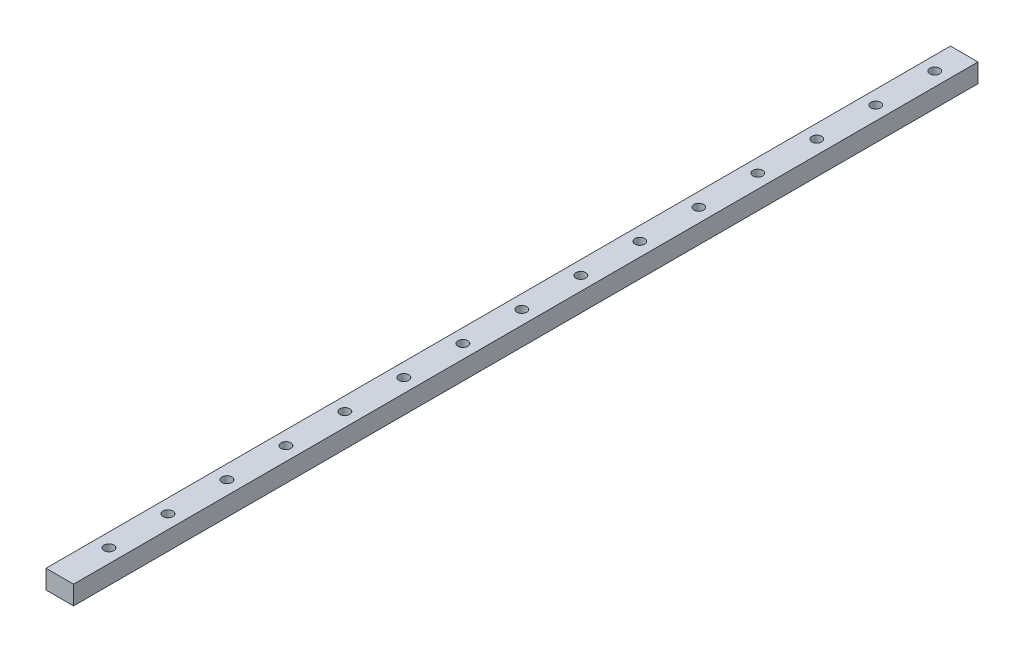
ISO-10303-21;
HEADER;
FILE_DESCRIPTION(('STEP AP214'),'2;1');
FILE_NAME('part.step','',(''),(''),'','','');
FILE_SCHEMA(('AUTOMOTIVE_DESIGN { 1 0 10303 214 1 1 1 1 }'));
ENDSEC;
DATA;
#1=APPLICATION_CONTEXT('core data for automotive mechanical design processes');
#2=APPLICATION_PROTOCOL_DEFINITION('international standard','automotive_design',2000,#1);
#3=PRODUCT_CONTEXT('',#1,'mechanical');
#4=PRODUCT('Part','Part','',(#3));
#5=PRODUCT_RELATED_PRODUCT_CATEGORY('part','',(#4));
#6=PRODUCT_DEFINITION_FORMATION('','',#4);
#7=PRODUCT_DEFINITION_CONTEXT('part definition',#1,'design');
#8=PRODUCT_DEFINITION('design','',#6,#7);
#9=PRODUCT_DEFINITION_SHAPE('','',#8);
#10=(LENGTH_UNIT() NAMED_UNIT(*) SI_UNIT(.MILLI.,.METRE.));
#11=(NAMED_UNIT(*) PLANE_ANGLE_UNIT() SI_UNIT($,.RADIAN.));
#12=(NAMED_UNIT(*) SI_UNIT($,.STERADIAN.) SOLID_ANGLE_UNIT());
#13=UNCERTAINTY_MEASURE_WITH_UNIT(LENGTH_MEASURE(1.E-05),#10,'distance_accuracy_value','');
#14=(GEOMETRIC_REPRESENTATION_CONTEXT(3) GLOBAL_UNCERTAINTY_ASSIGNED_CONTEXT((#13)) GLOBAL_UNIT_ASSIGNED_CONTEXT((#10,
#11,#12)) REPRESENTATION_CONTEXT('',''));
#15=CARTESIAN_POINT('',(0.,0.,0.));
#16=DIRECTION('',(0.,0.,1.));
#17=DIRECTION('',(1.,0.,0.));
#18=AXIS2_PLACEMENT_3D('',#15,#16,#17);
#19=CARTESIAN_POINT('',(0.,4.8,0.));
#20=DIRECTION('',(0.,1.,0.));
#21=DIRECTION('',(0.,0.,1.));
#22=AXIS2_PLACEMENT_3D('',#19,#20,#21);
#23=PLANE('',#22);
#24=CARTESIAN_POINT('',(2.03057627693155E-12,4.8,87.4999999999999));
#25=DIRECTION('',(0.,1.,0.));
#26=DIRECTION('',(0.,0.,1.));
#27=AXIS2_PLACEMENT_3D('',#24,#25,#26);
#28=CIRCLE('',#27,1.25);
#29=CARTESIAN_POINT('',(2.03057627693155E-12,4.8,88.7499999999999));
#30=VERTEX_POINT('',#29);
#31=EDGE_CURVE('E193',#30,#30,#28,.T.);
#32=ORIENTED_EDGE('',*,*,#31,.F.);
#33=EDGE_LOOP('',(#32));
#34=FACE_BOUND('',#33,.T.);
#35=CARTESIAN_POINT('',(1.71817992663439E-12,4.8,57.4999999999999));
#36=DIRECTION('',(0.,1.,0.));
#37=DIRECTION('',(0.,0.,1.));
#38=AXIS2_PLACEMENT_3D('',#35,#36,#37);
#39=CIRCLE('',#38,1.25);
#40=CARTESIAN_POINT('',(1.71817992663439E-12,4.8,58.7499999999999));
#41=VERTEX_POINT('',#40);
#42=EDGE_CURVE('E181',#41,#41,#39,.T.);
#43=ORIENTED_EDGE('',*,*,#42,.F.);
#44=EDGE_LOOP('',(#43));
#45=FACE_BOUND('',#44,.T.);
#46=CARTESIAN_POINT('',(1.40578357633722E-12,4.8,27.4999999999999));
#47=DIRECTION('',(0.,1.,0.));
#48=DIRECTION('',(0.,0.,1.));
#49=AXIS2_PLACEMENT_3D('',#46,#47,#48);
#50=CIRCLE('',#49,1.25);
#51=CARTESIAN_POINT('',(1.40578357633722E-12,4.8,28.7499999999999));
#52=VERTEX_POINT('',#51);
#53=EDGE_CURVE('E169',#52,#52,#50,.T.);
#54=ORIENTED_EDGE('',*,*,#53,.F.);
#55=EDGE_LOOP('',(#54));
#56=FACE_BOUND('',#55,.T.);
#57=CARTESIAN_POINT('',(1.09338722604006E-12,4.8,-2.5000000000001));
#58=DIRECTION('',(0.,1.,0.));
#59=DIRECTION('',(0.,0.,1.));
#60=AXIS2_PLACEMENT_3D('',#57,#58,#59);
#61=CIRCLE('',#60,1.25);
#62=CARTESIAN_POINT('',(1.09338722604006E-12,4.8,-1.2500000000001));
#63=VERTEX_POINT('',#62);
#64=EDGE_CURVE('E157',#63,#63,#61,.T.);
#65=ORIENTED_EDGE('',*,*,#64,.F.);
#66=EDGE_LOOP('',(#65));
#67=FACE_BOUND('',#66,.T.);
#68=CARTESIAN_POINT('',(7.80990875742902E-13,4.8,-32.5000000000001));
#69=DIRECTION('',(0.,1.,0.));
#70=DIRECTION('',(0.,0.,1.));
#71=AXIS2_PLACEMENT_3D('',#68,#69,#70);
#72=CIRCLE('',#71,1.25);
#73=CARTESIAN_POINT('',(7.80990875742902E-13,4.8,-31.2500000000001));
#74=VERTEX_POINT('',#73);
#75=EDGE_CURVE('E145',#74,#74,#72,.T.);
#76=ORIENTED_EDGE('',*,*,#75,.F.);
#77=EDGE_LOOP('',(#76));
#78=FACE_BOUND('',#77,.T.);
#79=CARTESIAN_POINT('',(4.68594525445742E-13,4.8,-62.5000000000001));
#80=DIRECTION('',(0.,1.,0.));
#81=DIRECTION('',(0.,0.,1.));
#82=AXIS2_PLACEMENT_3D('',#79,#80,#81);
#83=CIRCLE('',#82,1.25);
#84=CARTESIAN_POINT('',(4.68594525445742E-13,4.8,-61.2500000000001));
#85=VERTEX_POINT('',#84);
#86=EDGE_CURVE('E133',#85,#85,#83,.T.);
#87=ORIENTED_EDGE('',*,*,#86,.F.);
#88=EDGE_LOOP('',(#87));
#89=FACE_BOUND('',#88,.T.);
#90=CARTESIAN_POINT('',(1.5619817514858E-13,4.8,-92.5000000000001));
#91=DIRECTION('',(0.,1.,0.));
#92=DIRECTION('',(0.,0.,1.));
#93=AXIS2_PLACEMENT_3D('',#90,#91,#92);
#94=CIRCLE('',#93,1.25);
#95=CARTESIAN_POINT('',(1.5619817514858E-13,4.8,-91.2500000000001));
#96=VERTEX_POINT('',#95);
#97=EDGE_CURVE('E121',#96,#96,#94,.T.);
#98=ORIENTED_EDGE('',*,*,#97,.F.);
#99=EDGE_LOOP('',(#98));
#100=FACE_BOUND('',#99,.T.);
#101=DIRECTION('',(0.,0.,-1.));
#102=VECTOR('',#101,1.);
#103=CARTESIAN_POINT('',(3.49999999999999,4.8,-115.));
#104=LINE('',#103,#102);
#105=CARTESIAN_POINT('',(3.50000000000002,4.8,115.));
#106=VERTEX_POINT('',#105);
#107=CARTESIAN_POINT('',(3.49999999999999,4.8,-115.));
#108=VERTEX_POINT('',#107);
#109=EDGE_CURVE('E91',#106,#108,#104,.T.);
#110=ORIENTED_EDGE('',*,*,#109,.T.);
#111=DIRECTION('',(-1.,0.,0.));
#112=VECTOR('',#111,1.);
#113=CARTESIAN_POINT('',(-3.50000000000001,4.8,-115.));
#114=LINE('',#113,#112);
#115=CARTESIAN_POINT('',(-3.50000000000001,4.8,-115.));
#116=VERTEX_POINT('',#115);
#117=EDGE_CURVE('E86',#108,#116,#114,.T.);
#118=ORIENTED_EDGE('',*,*,#117,.T.);
#119=DIRECTION('',(0.,0.,1.));
#120=VECTOR('',#119,1.);
#121=CARTESIAN_POINT('',(-3.50000000000001,4.8,-115.));
#122=LINE('',#121,#120);
#123=CARTESIAN_POINT('',(-3.49999999999998,4.8,115.));
#124=VERTEX_POINT('',#123);
#125=EDGE_CURVE('E89',#116,#124,#122,.T.);
#126=ORIENTED_EDGE('',*,*,#125,.T.);
#127=DIRECTION('',(1.,0.,0.));
#128=VECTOR('',#127,1.);
#129=CARTESIAN_POINT('',(-3.49999999999998,4.8,115.));
#130=LINE('',#129,#128);
#131=EDGE_CURVE('E56',#124,#106,#130,.T.);
#132=ORIENTED_EDGE('',*,*,#131,.T.);
#133=EDGE_LOOP('',(#110,#118,#126,#132));
#134=FACE_BOUND('',#133,.T.);
#135=CARTESIAN_POINT('',(0.,4.8,-107.5));
#136=DIRECTION('',(0.,1.,0.));
#137=DIRECTION('',(0.,0.,1.));
#138=AXIS2_PLACEMENT_3D('',#135,#136,#137);
#139=CIRCLE('',#138,1.25);
#140=CARTESIAN_POINT('',(0.,4.8,-106.25));
#141=VERTEX_POINT('',#140);
#142=EDGE_CURVE('E106',#141,#141,#139,.T.);
#143=ORIENTED_EDGE('',*,*,#142,.F.);
#144=EDGE_LOOP('',(#143));
#145=FACE_BOUND('',#144,.T.);
#146=CARTESIAN_POINT('',(3.12396350297161E-13,4.8,-77.5000000000001));
#147=DIRECTION('',(0.,1.,0.));
#148=DIRECTION('',(0.,0.,1.));
#149=AXIS2_PLACEMENT_3D('',#146,#147,#148);
#150=CIRCLE('',#149,1.25);
#151=CARTESIAN_POINT('',(3.12396350297161E-13,4.8,-76.2500000000001));
#152=VERTEX_POINT('',#151);
#153=EDGE_CURVE('E127',#152,#152,#150,.T.);
#154=ORIENTED_EDGE('',*,*,#153,.F.);
#155=EDGE_LOOP('',(#154));
#156=FACE_BOUND('',#155,.T.);
#157=CARTESIAN_POINT('',(6.24792700594322E-13,4.8,-47.5000000000001));
#158=DIRECTION('',(0.,1.,0.));
#159=DIRECTION('',(0.,0.,1.));
#160=AXIS2_PLACEMENT_3D('',#157,#158,#159);
#161=CIRCLE('',#160,1.25);
#162=CARTESIAN_POINT('',(6.24792700594322E-13,4.8,-46.2500000000001));
#163=VERTEX_POINT('',#162);
#164=EDGE_CURVE('E139',#163,#163,#161,.T.);
#165=ORIENTED_EDGE('',*,*,#164,.F.);
#166=EDGE_LOOP('',(#165));
#167=FACE_BOUND('',#166,.T.);
#168=CARTESIAN_POINT('',(9.37189050891483E-13,4.8,-17.5000000000001));
#169=DIRECTION('',(0.,1.,0.));
#170=DIRECTION('',(0.,0.,1.));
#171=AXIS2_PLACEMENT_3D('',#168,#169,#170);
#172=CIRCLE('',#171,1.25);
#173=CARTESIAN_POINT('',(9.37189050891483E-13,4.8,-16.2500000000001));
#174=VERTEX_POINT('',#173);
#175=EDGE_CURVE('E151',#174,#174,#172,.T.);
#176=ORIENTED_EDGE('',*,*,#175,.F.);
#177=EDGE_LOOP('',(#176));
#178=FACE_BOUND('',#177,.T.);
#179=CARTESIAN_POINT('',(1.24958540118864E-12,4.8,12.4999999999999));
#180=DIRECTION('',(0.,1.,0.));
#181=DIRECTION('',(0.,0.,1.));
#182=AXIS2_PLACEMENT_3D('',#179,#180,#181);
#183=CIRCLE('',#182,1.25);
#184=CARTESIAN_POINT('',(1.24958540118864E-12,4.8,13.7499999999999));
#185=VERTEX_POINT('',#184);
#186=EDGE_CURVE('E163',#185,#185,#183,.T.);
#187=ORIENTED_EDGE('',*,*,#186,.F.);
#188=EDGE_LOOP('',(#187));
#189=FACE_BOUND('',#188,.T.);
#190=CARTESIAN_POINT('',(1.5619817514858E-12,4.8,42.4999999999999));
#191=DIRECTION('',(0.,1.,0.));
#192=DIRECTION('',(0.,0.,1.));
#193=AXIS2_PLACEMENT_3D('',#190,#191,#192);
#194=CIRCLE('',#193,1.25);
#195=CARTESIAN_POINT('',(1.5619817514858E-12,4.8,43.7499999999999));
#196=VERTEX_POINT('',#195);
#197=EDGE_CURVE('E175',#196,#196,#194,.T.);
#198=ORIENTED_EDGE('',*,*,#197,.F.);
#199=EDGE_LOOP('',(#198));
#200=FACE_BOUND('',#199,.T.);
#201=CARTESIAN_POINT('',(1.87437810178297E-12,4.8,72.4999999999999));
#202=DIRECTION('',(0.,1.,0.));
#203=DIRECTION('',(0.,0.,1.));
#204=AXIS2_PLACEMENT_3D('',#201,#202,#203);
#205=CIRCLE('',#204,1.25);
#206=CARTESIAN_POINT('',(1.87437810178297E-12,4.8,73.7499999999999));
#207=VERTEX_POINT('',#206);
#208=EDGE_CURVE('E187',#207,#207,#205,.T.);
#209=ORIENTED_EDGE('',*,*,#208,.F.);
#210=EDGE_LOOP('',(#209));
#211=FACE_BOUND('',#210,.T.);
#212=CARTESIAN_POINT('',(2.18677445208013E-12,4.8,102.5));
#213=DIRECTION('',(0.,1.,0.));
#214=DIRECTION('',(0.,0.,1.));
#215=AXIS2_PLACEMENT_3D('',#212,#213,#214);
#216=CIRCLE('',#215,1.25);
#217=CARTESIAN_POINT('',(2.18677445208013E-12,4.8,103.75));
#218=VERTEX_POINT('',#217);
#219=EDGE_CURVE('E199',#218,#218,#216,.T.);
#220=ORIENTED_EDGE('',*,*,#219,.F.);
#221=EDGE_LOOP('',(#220));
#222=FACE_BOUND('',#221,.T.);
#223=ADVANCED_FACE('F39',(#34,#45,#56,#67,#78,#89,#100,#134,#145,#156,#167,#178,#189,#200,#211,
#222),#23,.T.);
#224=CARTESIAN_POINT('',(0.,0.,0.));
#225=DIRECTION('',(0.,1.,0.));
#226=DIRECTION('',(0.,0.,1.));
#227=AXIS2_PLACEMENT_3D('',#224,#225,#226);
#228=PLANE('',#227);
#229=DIRECTION('',(0.,0.,-1.));
#230=VECTOR('',#229,1.);
#231=CARTESIAN_POINT('',(3.49999999999999,0.,-115.));
#232=LINE('',#231,#230);
#233=CARTESIAN_POINT('',(3.50000000000002,0.,115.));
#234=VERTEX_POINT('',#233);
#235=CARTESIAN_POINT('',(3.49999999999999,0.,-115.));
#236=VERTEX_POINT('',#235);
#237=EDGE_CURVE('E103',#234,#236,#232,.T.);
#238=ORIENTED_EDGE('',*,*,#237,.F.);
#239=DIRECTION('',(1.,0.,0.));
#240=VECTOR('',#239,1.);
#241=CARTESIAN_POINT('',(-3.49999999999998,0.,115.));
#242=LINE('',#241,#240);
#243=CARTESIAN_POINT('',(-3.49999999999998,0.,115.));
#244=VERTEX_POINT('',#243);
#245=EDGE_CURVE('E79',#244,#234,#242,.T.);
#246=ORIENTED_EDGE('',*,*,#245,.F.);
#247=DIRECTION('',(0.,0.,1.));
#248=VECTOR('',#247,1.);
#249=CARTESIAN_POINT('',(-3.50000000000001,0.,-115.));
#250=LINE('',#249,#248);
#251=CARTESIAN_POINT('',(-3.50000000000001,0.,-115.));
#252=VERTEX_POINT('',#251);
#253=EDGE_CURVE('E73',#252,#244,#250,.T.);
#254=ORIENTED_EDGE('',*,*,#253,.F.);
#255=DIRECTION('',(-1.,0.,0.));
#256=VECTOR('',#255,1.);
#257=CARTESIAN_POINT('',(-3.50000000000001,0.,-115.));
#258=LINE('',#257,#256);
#259=EDGE_CURVE('E95',#236,#252,#258,.T.);
#260=ORIENTED_EDGE('',*,*,#259,.F.);
#261=EDGE_LOOP('',(#238,#246,#254,#260));
#262=FACE_BOUND('',#261,.T.);
#263=CARTESIAN_POINT('',(0.,0.,-107.5));
#264=DIRECTION('',(0.,1.,0.));
#265=DIRECTION('',(0.,0.,1.));
#266=AXIS2_PLACEMENT_3D('',#263,#264,#265);
#267=CIRCLE('',#266,1.25);
#268=CARTESIAN_POINT('',(0.,0.,-106.25));
#269=VERTEX_POINT('',#268);
#270=EDGE_CURVE('E118',#269,#269,#267,.T.);
#271=ORIENTED_EDGE('',*,*,#270,.T.);
#272=EDGE_LOOP('',(#271));
#273=FACE_BOUND('',#272,.T.);
#274=CARTESIAN_POINT('',(1.5619817514858E-13,0.,-92.5000000000001));
#275=DIRECTION('',(0.,1.,0.));
#276=DIRECTION('',(0.,0.,1.));
#277=AXIS2_PLACEMENT_3D('',#274,#275,#276);
#278=CIRCLE('',#277,1.25);
#279=CARTESIAN_POINT('',(1.5619817514858E-13,0.,-91.2500000000001));
#280=VERTEX_POINT('',#279);
#281=EDGE_CURVE('E124',#280,#280,#278,.T.);
#282=ORIENTED_EDGE('',*,*,#281,.T.);
#283=EDGE_LOOP('',(#282));
#284=FACE_BOUND('',#283,.T.);
#285=CARTESIAN_POINT('',(3.12396350297161E-13,0.,-77.5000000000001));
#286=DIRECTION('',(0.,1.,0.));
#287=DIRECTION('',(0.,0.,1.));
#288=AXIS2_PLACEMENT_3D('',#285,#286,#287);
#289=CIRCLE('',#288,1.25);
#290=CARTESIAN_POINT('',(3.12396350297161E-13,0.,-76.2500000000001));
#291=VERTEX_POINT('',#290);
#292=EDGE_CURVE('E130',#291,#291,#289,.T.);
#293=ORIENTED_EDGE('',*,*,#292,.T.);
#294=EDGE_LOOP('',(#293));
#295=FACE_BOUND('',#294,.T.);
#296=CARTESIAN_POINT('',(4.68594525445742E-13,0.,-62.5000000000001));
#297=DIRECTION('',(0.,1.,0.));
#298=DIRECTION('',(0.,0.,1.));
#299=AXIS2_PLACEMENT_3D('',#296,#297,#298);
#300=CIRCLE('',#299,1.25);
#301=CARTESIAN_POINT('',(4.68594525445742E-13,0.,-61.2500000000001));
#302=VERTEX_POINT('',#301);
#303=EDGE_CURVE('E136',#302,#302,#300,.T.);
#304=ORIENTED_EDGE('',*,*,#303,.T.);
#305=EDGE_LOOP('',(#304));
#306=FACE_BOUND('',#305,.T.);
#307=CARTESIAN_POINT('',(6.24792700594322E-13,0.,-47.5000000000001));
#308=DIRECTION('',(0.,1.,0.));
#309=DIRECTION('',(0.,0.,1.));
#310=AXIS2_PLACEMENT_3D('',#307,#308,#309);
#311=CIRCLE('',#310,1.25);
#312=CARTESIAN_POINT('',(6.24792700594322E-13,0.,-46.2500000000001));
#313=VERTEX_POINT('',#312);
#314=EDGE_CURVE('E142',#313,#313,#311,.T.);
#315=ORIENTED_EDGE('',*,*,#314,.T.);
#316=EDGE_LOOP('',(#315));
#317=FACE_BOUND('',#316,.T.);
#318=CARTESIAN_POINT('',(7.80990875742902E-13,0.,-32.5000000000001));
#319=DIRECTION('',(0.,1.,0.));
#320=DIRECTION('',(0.,0.,1.));
#321=AXIS2_PLACEMENT_3D('',#318,#319,#320);
#322=CIRCLE('',#321,1.25);
#323=CARTESIAN_POINT('',(7.80990875742902E-13,0.,-31.2500000000001));
#324=VERTEX_POINT('',#323);
#325=EDGE_CURVE('E148',#324,#324,#322,.T.);
#326=ORIENTED_EDGE('',*,*,#325,.T.);
#327=EDGE_LOOP('',(#326));
#328=FACE_BOUND('',#327,.T.);
#329=CARTESIAN_POINT('',(9.37189050891483E-13,0.,-17.5000000000001));
#330=DIRECTION('',(0.,1.,0.));
#331=DIRECTION('',(0.,0.,1.));
#332=AXIS2_PLACEMENT_3D('',#329,#330,#331);
#333=CIRCLE('',#332,1.25);
#334=CARTESIAN_POINT('',(9.37189050891483E-13,0.,-16.2500000000001));
#335=VERTEX_POINT('',#334);
#336=EDGE_CURVE('E154',#335,#335,#333,.T.);
#337=ORIENTED_EDGE('',*,*,#336,.T.);
#338=EDGE_LOOP('',(#337));
#339=FACE_BOUND('',#338,.T.);
#340=CARTESIAN_POINT('',(1.09338722604006E-12,0.,-2.5000000000001));
#341=DIRECTION('',(0.,1.,0.));
#342=DIRECTION('',(0.,0.,1.));
#343=AXIS2_PLACEMENT_3D('',#340,#341,#342);
#344=CIRCLE('',#343,1.25);
#345=CARTESIAN_POINT('',(1.09338722604006E-12,0.,-1.2500000000001));
#346=VERTEX_POINT('',#345);
#347=EDGE_CURVE('E160',#346,#346,#344,.T.);
#348=ORIENTED_EDGE('',*,*,#347,.T.);
#349=EDGE_LOOP('',(#348));
#350=FACE_BOUND('',#349,.T.);
#351=CARTESIAN_POINT('',(1.24958540118864E-12,0.,12.4999999999999));
#352=DIRECTION('',(0.,1.,0.));
#353=DIRECTION('',(0.,0.,1.));
#354=AXIS2_PLACEMENT_3D('',#351,#352,#353);
#355=CIRCLE('',#354,1.25);
#356=CARTESIAN_POINT('',(1.24958540118864E-12,0.,13.7499999999999));
#357=VERTEX_POINT('',#356);
#358=EDGE_CURVE('E166',#357,#357,#355,.T.);
#359=ORIENTED_EDGE('',*,*,#358,.T.);
#360=EDGE_LOOP('',(#359));
#361=FACE_BOUND('',#360,.T.);
#362=CARTESIAN_POINT('',(1.40578357633722E-12,0.,27.4999999999999));
#363=DIRECTION('',(0.,1.,0.));
#364=DIRECTION('',(0.,0.,1.));
#365=AXIS2_PLACEMENT_3D('',#362,#363,#364);
#366=CIRCLE('',#365,1.25);
#367=CARTESIAN_POINT('',(1.40578357633722E-12,0.,28.7499999999999));
#368=VERTEX_POINT('',#367);
#369=EDGE_CURVE('E172',#368,#368,#366,.T.);
#370=ORIENTED_EDGE('',*,*,#369,.T.);
#371=EDGE_LOOP('',(#370));
#372=FACE_BOUND('',#371,.T.);
#373=CARTESIAN_POINT('',(1.5619817514858E-12,0.,42.4999999999999));
#374=DIRECTION('',(0.,1.,0.));
#375=DIRECTION('',(0.,0.,1.));
#376=AXIS2_PLACEMENT_3D('',#373,#374,#375);
#377=CIRCLE('',#376,1.25);
#378=CARTESIAN_POINT('',(1.5619817514858E-12,0.,43.7499999999999));
#379=VERTEX_POINT('',#378);
#380=EDGE_CURVE('E178',#379,#379,#377,.T.);
#381=ORIENTED_EDGE('',*,*,#380,.T.);
#382=EDGE_LOOP('',(#381));
#383=FACE_BOUND('',#382,.T.);
#384=CARTESIAN_POINT('',(1.71817992663439E-12,0.,57.4999999999999));
#385=DIRECTION('',(0.,1.,0.));
#386=DIRECTION('',(0.,0.,1.));
#387=AXIS2_PLACEMENT_3D('',#384,#385,#386);
#388=CIRCLE('',#387,1.25);
#389=CARTESIAN_POINT('',(1.71817992663439E-12,0.,58.7499999999999));
#390=VERTEX_POINT('',#389);
#391=EDGE_CURVE('E184',#390,#390,#388,.T.);
#392=ORIENTED_EDGE('',*,*,#391,.T.);
#393=EDGE_LOOP('',(#392));
#394=FACE_BOUND('',#393,.T.);
#395=CARTESIAN_POINT('',(1.87437810178297E-12,0.,72.4999999999999));
#396=DIRECTION('',(0.,1.,0.));
#397=DIRECTION('',(0.,0.,1.));
#398=AXIS2_PLACEMENT_3D('',#395,#396,#397);
#399=CIRCLE('',#398,1.25);
#400=CARTESIAN_POINT('',(1.87437810178297E-12,0.,73.7499999999999));
#401=VERTEX_POINT('',#400);
#402=EDGE_CURVE('E190',#401,#401,#399,.T.);
#403=ORIENTED_EDGE('',*,*,#402,.T.);
#404=EDGE_LOOP('',(#403));
#405=FACE_BOUND('',#404,.T.);
#406=CARTESIAN_POINT('',(2.03057627693155E-12,0.,87.4999999999999));
#407=DIRECTION('',(0.,1.,0.));
#408=DIRECTION('',(0.,0.,1.));
#409=AXIS2_PLACEMENT_3D('',#406,#407,#408);
#410=CIRCLE('',#409,1.25);
#411=CARTESIAN_POINT('',(2.03057627693155E-12,0.,88.7499999999999));
#412=VERTEX_POINT('',#411);
#413=EDGE_CURVE('E196',#412,#412,#410,.T.);
#414=ORIENTED_EDGE('',*,*,#413,.T.);
#415=EDGE_LOOP('',(#414));
#416=FACE_BOUND('',#415,.T.);
#417=CARTESIAN_POINT('',(2.18677445208013E-12,0.,102.5));
#418=DIRECTION('',(0.,1.,0.));
#419=DIRECTION('',(0.,0.,1.));
#420=AXIS2_PLACEMENT_3D('',#417,#418,#419);
#421=CIRCLE('',#420,1.25);
#422=CARTESIAN_POINT('',(2.18677445208013E-12,0.,103.75));
#423=VERTEX_POINT('',#422);
#424=EDGE_CURVE('E202',#423,#423,#421,.T.);
#425=ORIENTED_EDGE('',*,*,#424,.T.);
#426=EDGE_LOOP('',(#425));
#427=FACE_BOUND('',#426,.T.);
#428=ADVANCED_FACE('F114',(#262,#273,#284,#295,#306,#317,#328,#339,#350,#361,#372,#383,#394,
#405,#416,#427),#228,.F.);
#429=CARTESIAN_POINT('',(3.49999999999999,4.8,-115.));
#430=DIRECTION('',(-1.,0.,0.));
#431=DIRECTION('',(0.,0.,1.));
#432=AXIS2_PLACEMENT_3D('',#429,#430,#431);
#433=PLANE('',#432);
#434=ORIENTED_EDGE('',*,*,#237,.T.);
#435=DIRECTION('',(0.,-1.,0.));
#436=VECTOR('',#435,1.);
#437=CARTESIAN_POINT('',(3.49999999999999,4.8,-115.));
#438=LINE('',#437,#436);
#439=EDGE_CURVE('E11',#108,#236,#438,.T.);
#440=ORIENTED_EDGE('',*,*,#439,.F.);
#441=ORIENTED_EDGE('',*,*,#109,.F.);
#442=DIRECTION('',(0.,-1.,0.));
#443=VECTOR('',#442,1.);
#444=CARTESIAN_POINT('',(3.50000000000002,4.8,115.));
#445=LINE('',#444,#443);
#446=EDGE_CURVE('E99',#106,#234,#445,.T.);
#447=ORIENTED_EDGE('',*,*,#446,.T.);
#448=EDGE_LOOP('',(#434,#440,#441,#447));
#449=FACE_BOUND('',#448,.T.);
#450=ADVANCED_FACE('F41',(#449),#433,.F.);
#451=CARTESIAN_POINT('',(-3.50000000000001,4.8,-115.));
#452=DIRECTION('',(0.,0.,1.));
#453=DIRECTION('',(1.,0.,0.));
#454=AXIS2_PLACEMENT_3D('',#451,#452,#453);
#455=PLANE('',#454);
#456=ORIENTED_EDGE('',*,*,#259,.T.);
#457=DIRECTION('',(0.,-1.,0.));
#458=VECTOR('',#457,1.);
#459=CARTESIAN_POINT('',(-3.50000000000001,4.8,-115.));
#460=LINE('',#459,#458);
#461=EDGE_CURVE('E48',#116,#252,#460,.T.);
#462=ORIENTED_EDGE('',*,*,#461,.F.);
#463=ORIENTED_EDGE('',*,*,#117,.F.);
#464=ORIENTED_EDGE('',*,*,#439,.T.);
#465=EDGE_LOOP('',(#456,#462,#463,#464));
#466=FACE_BOUND('',#465,.T.);
#467=ADVANCED_FACE('F94',(#466),#455,.F.);
#468=CARTESIAN_POINT('',(-3.50000000000001,4.8,-115.));
#469=DIRECTION('',(1.,0.,0.));
#470=DIRECTION('',(0.,0.,-1.));
#471=AXIS2_PLACEMENT_3D('',#468,#469,#470);
#472=PLANE('',#471);
#473=ORIENTED_EDGE('',*,*,#253,.T.);
#474=DIRECTION('',(0.,-1.,0.));
#475=VECTOR('',#474,1.);
#476=CARTESIAN_POINT('',(-3.49999999999998,4.8,115.));
#477=LINE('',#476,#475);
#478=EDGE_CURVE('E96',#124,#244,#477,.T.);
#479=ORIENTED_EDGE('',*,*,#478,.F.);
#480=ORIENTED_EDGE('',*,*,#125,.F.);
#481=ORIENTED_EDGE('',*,*,#461,.T.);
#482=EDGE_LOOP('',(#473,#479,#480,#481));
#483=FACE_BOUND('',#482,.T.);
#484=ADVANCED_FACE('F97',(#483),#472,.F.);
#485=CARTESIAN_POINT('',(-3.49999999999998,4.8,115.));
#486=DIRECTION('',(0.,0.,-1.));
#487=DIRECTION('',(-1.,0.,0.));
#488=AXIS2_PLACEMENT_3D('',#485,#486,#487);
#489=PLANE('',#488);
#490=ORIENTED_EDGE('',*,*,#245,.T.);
#491=ORIENTED_EDGE('',*,*,#446,.F.);
#492=ORIENTED_EDGE('',*,*,#131,.F.);
#493=ORIENTED_EDGE('',*,*,#478,.T.);
#494=EDGE_LOOP('',(#490,#491,#492,#493));
#495=FACE_BOUND('',#494,.T.);
#496=ADVANCED_FACE('F111',(#495),#489,.F.);
#497=CARTESIAN_POINT('',(0.,4.8,-107.5));
#498=DIRECTION('',(0.,-1.,0.));
#499=DIRECTION('',(0.,0.,-1.));
#500=AXIS2_PLACEMENT_3D('',#497,#498,#499);
#501=CYLINDRICAL_SURFACE('',#500,1.25);
#502=ORIENTED_EDGE('',*,*,#142,.T.);
#503=EDGE_LOOP('',(#502));
#504=FACE_BOUND('',#503,.T.);
#505=ORIENTED_EDGE('',*,*,#270,.F.);
#506=EDGE_LOOP('',(#505));
#507=FACE_BOUND('',#506,.T.);
#508=ADVANCED_FACE('F221',(#504,#507),#501,.F.);
#509=CARTESIAN_POINT('',(1.5619817514858E-13,4.8,-92.5000000000001));
#510=DIRECTION('',(0.,-1.,0.));
#511=DIRECTION('',(0.,0.,-1.));
#512=AXIS2_PLACEMENT_3D('',#509,#510,#511);
#513=CYLINDRICAL_SURFACE('',#512,1.25);
#514=ORIENTED_EDGE('',*,*,#97,.T.);
#515=EDGE_LOOP('',(#514));
#516=FACE_BOUND('',#515,.T.);
#517=ORIENTED_EDGE('',*,*,#281,.F.);
#518=EDGE_LOOP('',(#517));
#519=FACE_BOUND('',#518,.T.);
#520=ADVANCED_FACE('F256',(#516,#519),#513,.F.);
#521=CARTESIAN_POINT('',(3.12396350297161E-13,4.8,-77.5000000000001));
#522=DIRECTION('',(0.,-1.,0.));
#523=DIRECTION('',(0.,0.,-1.));
#524=AXIS2_PLACEMENT_3D('',#521,#522,#523);
#525=CYLINDRICAL_SURFACE('',#524,1.25);
#526=ORIENTED_EDGE('',*,*,#153,.T.);
#527=EDGE_LOOP('',(#526));
#528=FACE_BOUND('',#527,.T.);
#529=ORIENTED_EDGE('',*,*,#292,.F.);
#530=EDGE_LOOP('',(#529));
#531=FACE_BOUND('',#530,.T.);
#532=ADVANCED_FACE('F263',(#528,#531),#525,.F.);
#533=CARTESIAN_POINT('',(4.68594525445742E-13,4.8,-62.5000000000001));
#534=DIRECTION('',(0.,-1.,0.));
#535=DIRECTION('',(0.,0.,-1.));
#536=AXIS2_PLACEMENT_3D('',#533,#534,#535);
#537=CYLINDRICAL_SURFACE('',#536,1.25);
#538=ORIENTED_EDGE('',*,*,#86,.T.);
#539=EDGE_LOOP('',(#538));
#540=FACE_BOUND('',#539,.T.);
#541=ORIENTED_EDGE('',*,*,#303,.F.);
#542=EDGE_LOOP('',(#541));
#543=FACE_BOUND('',#542,.T.);
#544=ADVANCED_FACE('F270',(#540,#543),#537,.F.);
#545=CARTESIAN_POINT('',(6.24792700594322E-13,4.8,-47.5000000000001));
#546=DIRECTION('',(0.,-1.,0.));
#547=DIRECTION('',(0.,0.,-1.));
#548=AXIS2_PLACEMENT_3D('',#545,#546,#547);
#549=CYLINDRICAL_SURFACE('',#548,1.25);
#550=ORIENTED_EDGE('',*,*,#164,.T.);
#551=EDGE_LOOP('',(#550));
#552=FACE_BOUND('',#551,.T.);
#553=ORIENTED_EDGE('',*,*,#314,.F.);
#554=EDGE_LOOP('',(#553));
#555=FACE_BOUND('',#554,.T.);
#556=ADVANCED_FACE('F278',(#552,#555),#549,.F.);
#557=CARTESIAN_POINT('',(7.80990875742902E-13,4.8,-32.5000000000001));
#558=DIRECTION('',(0.,-1.,0.));
#559=DIRECTION('',(0.,0.,-1.));
#560=AXIS2_PLACEMENT_3D('',#557,#558,#559);
#561=CYLINDRICAL_SURFACE('',#560,1.25);
#562=ORIENTED_EDGE('',*,*,#75,.T.);
#563=EDGE_LOOP('',(#562));
#564=FACE_BOUND('',#563,.T.);
#565=ORIENTED_EDGE('',*,*,#325,.F.);
#566=EDGE_LOOP('',(#565));
#567=FACE_BOUND('',#566,.T.);
#568=ADVANCED_FACE('F286',(#564,#567),#561,.F.);
#569=CARTESIAN_POINT('',(9.37189050891483E-13,4.8,-17.5000000000001));
#570=DIRECTION('',(0.,-1.,0.));
#571=DIRECTION('',(0.,0.,-1.));
#572=AXIS2_PLACEMENT_3D('',#569,#570,#571);
#573=CYLINDRICAL_SURFACE('',#572,1.25);
#574=ORIENTED_EDGE('',*,*,#175,.T.);
#575=EDGE_LOOP('',(#574));
#576=FACE_BOUND('',#575,.T.);
#577=ORIENTED_EDGE('',*,*,#336,.F.);
#578=EDGE_LOOP('',(#577));
#579=FACE_BOUND('',#578,.T.);
#580=ADVANCED_FACE('F294',(#576,#579),#573,.F.);
#581=CARTESIAN_POINT('',(1.09338722604006E-12,4.8,-2.5000000000001));
#582=DIRECTION('',(0.,-1.,0.));
#583=DIRECTION('',(0.,0.,-1.));
#584=AXIS2_PLACEMENT_3D('',#581,#582,#583);
#585=CYLINDRICAL_SURFACE('',#584,1.25);
#586=ORIENTED_EDGE('',*,*,#64,.T.);
#587=EDGE_LOOP('',(#586));
#588=FACE_BOUND('',#587,.T.);
#589=ORIENTED_EDGE('',*,*,#347,.F.);
#590=EDGE_LOOP('',(#589));
#591=FACE_BOUND('',#590,.T.);
#592=ADVANCED_FACE('F302',(#588,#591),#585,.F.);
#593=CARTESIAN_POINT('',(1.24958540118864E-12,4.8,12.4999999999999));
#594=DIRECTION('',(0.,-1.,0.));
#595=DIRECTION('',(0.,0.,-1.));
#596=AXIS2_PLACEMENT_3D('',#593,#594,#595);
#597=CYLINDRICAL_SURFACE('',#596,1.25);
#598=ORIENTED_EDGE('',*,*,#186,.T.);
#599=EDGE_LOOP('',(#598));
#600=FACE_BOUND('',#599,.T.);
#601=ORIENTED_EDGE('',*,*,#358,.F.);
#602=EDGE_LOOP('',(#601));
#603=FACE_BOUND('',#602,.T.);
#604=ADVANCED_FACE('F310',(#600,#603),#597,.F.);
#605=CARTESIAN_POINT('',(1.40578357633722E-12,4.8,27.4999999999999));
#606=DIRECTION('',(0.,-1.,0.));
#607=DIRECTION('',(0.,0.,-1.));
#608=AXIS2_PLACEMENT_3D('',#605,#606,#607);
#609=CYLINDRICAL_SURFACE('',#608,1.25);
#610=ORIENTED_EDGE('',*,*,#53,.T.);
#611=EDGE_LOOP('',(#610));
#612=FACE_BOUND('',#611,.T.);
#613=ORIENTED_EDGE('',*,*,#369,.F.);
#614=EDGE_LOOP('',(#613));
#615=FACE_BOUND('',#614,.T.);
#616=ADVANCED_FACE('F318',(#612,#615),#609,.F.);
#617=CARTESIAN_POINT('',(1.5619817514858E-12,4.8,42.4999999999999));
#618=DIRECTION('',(0.,-1.,0.));
#619=DIRECTION('',(0.,0.,-1.));
#620=AXIS2_PLACEMENT_3D('',#617,#618,#619);
#621=CYLINDRICAL_SURFACE('',#620,1.25);
#622=ORIENTED_EDGE('',*,*,#197,.T.);
#623=EDGE_LOOP('',(#622));
#624=FACE_BOUND('',#623,.T.);
#625=ORIENTED_EDGE('',*,*,#380,.F.);
#626=EDGE_LOOP('',(#625));
#627=FACE_BOUND('',#626,.T.);
#628=ADVANCED_FACE('F326',(#624,#627),#621,.F.);
#629=CARTESIAN_POINT('',(1.71817992663439E-12,4.8,57.4999999999999));
#630=DIRECTION('',(0.,-1.,0.));
#631=DIRECTION('',(0.,0.,-1.));
#632=AXIS2_PLACEMENT_3D('',#629,#630,#631);
#633=CYLINDRICAL_SURFACE('',#632,1.25);
#634=ORIENTED_EDGE('',*,*,#42,.T.);
#635=EDGE_LOOP('',(#634));
#636=FACE_BOUND('',#635,.T.);
#637=ORIENTED_EDGE('',*,*,#391,.F.);
#638=EDGE_LOOP('',(#637));
#639=FACE_BOUND('',#638,.T.);
#640=ADVANCED_FACE('F334',(#636,#639),#633,.F.);
#641=CARTESIAN_POINT('',(1.87437810178297E-12,4.8,72.4999999999999));
#642=DIRECTION('',(0.,-1.,0.));
#643=DIRECTION('',(0.,0.,-1.));
#644=AXIS2_PLACEMENT_3D('',#641,#642,#643);
#645=CYLINDRICAL_SURFACE('',#644,1.25);
#646=ORIENTED_EDGE('',*,*,#208,.T.);
#647=EDGE_LOOP('',(#646));
#648=FACE_BOUND('',#647,.T.);
#649=ORIENTED_EDGE('',*,*,#402,.F.);
#650=EDGE_LOOP('',(#649));
#651=FACE_BOUND('',#650,.T.);
#652=ADVANCED_FACE('F342',(#648,#651),#645,.F.);
#653=CARTESIAN_POINT('',(2.03057627693155E-12,4.8,87.4999999999999));
#654=DIRECTION('',(0.,-1.,0.));
#655=DIRECTION('',(0.,0.,-1.));
#656=AXIS2_PLACEMENT_3D('',#653,#654,#655);
#657=CYLINDRICAL_SURFACE('',#656,1.25);
#658=ORIENTED_EDGE('',*,*,#31,.T.);
#659=EDGE_LOOP('',(#658));
#660=FACE_BOUND('',#659,.T.);
#661=ORIENTED_EDGE('',*,*,#413,.F.);
#662=EDGE_LOOP('',(#661));
#663=FACE_BOUND('',#662,.T.);
#664=ADVANCED_FACE('F350',(#660,#663),#657,.F.);
#665=CARTESIAN_POINT('',(2.18677445208013E-12,4.8,102.5));
#666=DIRECTION('',(0.,-1.,0.));
#667=DIRECTION('',(0.,0.,-1.));
#668=AXIS2_PLACEMENT_3D('',#665,#666,#667);
#669=CYLINDRICAL_SURFACE('',#668,1.25);
#670=ORIENTED_EDGE('',*,*,#219,.T.);
#671=EDGE_LOOP('',(#670));
#672=FACE_BOUND('',#671,.T.);
#673=ORIENTED_EDGE('',*,*,#424,.F.);
#674=EDGE_LOOP('',(#673));
#675=FACE_BOUND('',#674,.T.);
#676=ADVANCED_FACE('F208',(#672,#675),#669,.F.);
#677=CLOSED_SHELL('',(#223,#428,#450,#467,#484,#496,#508,#520,#532,#544,#556,#568,#580,#592,
#604,#616,#628,#640,#652,#664,#676));
#678=MANIFOLD_SOLID_BREP('B2',#677);
#679=ADVANCED_BREP_SHAPE_REPRESENTATION('',(#18,#678),#14);
#680=SHAPE_DEFINITION_REPRESENTATION(#9,#679);
ENDSEC;
END-ISO-10303-21;
